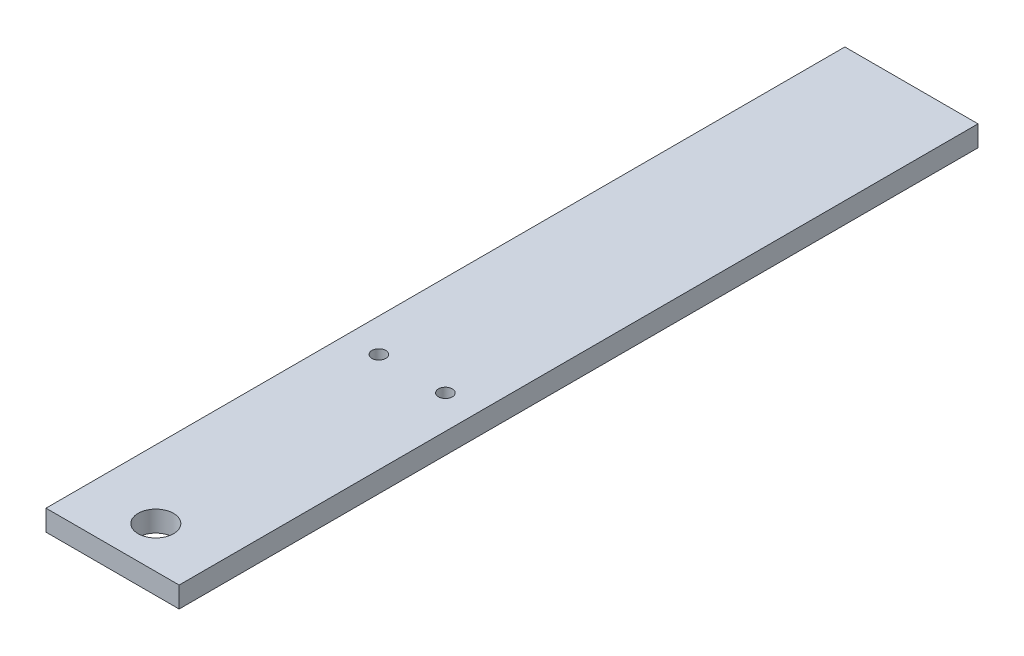
ISO-10303-21;
HEADER;
FILE_DESCRIPTION(('STEP AP214'),'2;1');
FILE_NAME('part.step','',(''),(''),'','','');
FILE_SCHEMA(('AUTOMOTIVE_DESIGN { 1 0 10303 214 1 1 1 1 }'));
ENDSEC;
DATA;
#1=APPLICATION_CONTEXT('core data for automotive mechanical design processes');
#2=APPLICATION_PROTOCOL_DEFINITION('international standard','automotive_design',2000,#1);
#3=PRODUCT_CONTEXT('',#1,'mechanical');
#4=PRODUCT('Part','Part','',(#3));
#5=PRODUCT_RELATED_PRODUCT_CATEGORY('part','',(#4));
#6=PRODUCT_DEFINITION_FORMATION('','',#4);
#7=PRODUCT_DEFINITION_CONTEXT('part definition',#1,'design');
#8=PRODUCT_DEFINITION('design','',#6,#7);
#9=PRODUCT_DEFINITION_SHAPE('','',#8);
#10=(LENGTH_UNIT() NAMED_UNIT(*) SI_UNIT(.MILLI.,.METRE.));
#11=(NAMED_UNIT(*) PLANE_ANGLE_UNIT() SI_UNIT($,.RADIAN.));
#12=(NAMED_UNIT(*) SI_UNIT($,.STERADIAN.) SOLID_ANGLE_UNIT());
#13=UNCERTAINTY_MEASURE_WITH_UNIT(LENGTH_MEASURE(1.E-05),#10,'distance_accuracy_value','');
#14=(GEOMETRIC_REPRESENTATION_CONTEXT(3) GLOBAL_UNCERTAINTY_ASSIGNED_CONTEXT((#13)) GLOBAL_UNIT_ASSIGNED_CONTEXT((#10,
#11,#12)) REPRESENTATION_CONTEXT('',''));
#15=CARTESIAN_POINT('',(0.,0.,0.));
#16=DIRECTION('',(0.,0.,1.));
#17=DIRECTION('',(1.,0.,0.));
#18=AXIS2_PLACEMENT_3D('',#15,#16,#17);
#19=CARTESIAN_POINT('',(25.4,-3.96875,76.2));
#20=DIRECTION('',(0.,1.,0.));
#21=DIRECTION('',(0.,0.,1.));
#22=AXIS2_PLACEMENT_3D('',#19,#20,#21);
#23=PLANE('',#22);
#24=CARTESIAN_POINT('',(-12.7,-3.96875,-38.1));
#25=DIRECTION('',(0.,-1.,0.));
#26=DIRECTION('',(0.,0.,-1.));
#27=AXIS2_PLACEMENT_3D('',#24,#25,#26);
#28=CIRCLE('',#27,5.2);
#29=CARTESIAN_POINT('',(-12.7,-3.96875,-43.3));
#30=VERTEX_POINT('',#29);
#31=EDGE_CURVE('E114',#30,#30,#28,.T.);
#32=ORIENTED_EDGE('',*,*,#31,.F.);
#33=EDGE_LOOP('',(#32));
#34=FACE_BOUND('',#33,.T.);
#35=CARTESIAN_POINT('',(0.625840615318438,-3.96875,60.325));
#36=DIRECTION('',(0.,1.,0.));
#37=DIRECTION('',(0.,0.,1.));
#38=AXIS2_PLACEMENT_3D('',#35,#36,#37);
#39=CIRCLE('',#38,6.75);
#40=CARTESIAN_POINT('',(0.625840615318438,-3.96875,67.075));
#41=VERTEX_POINT('',#40);
#42=EDGE_CURVE('E126',#41,#41,#39,.T.);
#43=ORIENTED_EDGE('',*,*,#42,.T.);
#44=EDGE_LOOP('',(#43));
#45=FACE_BOUND('',#44,.T.);
#46=DIRECTION('',(0.,0.,-1.));
#47=VECTOR('',#46,1.);
#48=CARTESIAN_POINT('',(-25.4,-3.96875,76.2));
#49=LINE('',#48,#47);
#50=CARTESIAN_POINT('',(-25.4,-3.96875,76.2));
#51=VERTEX_POINT('',#50);
#52=CARTESIAN_POINT('',(-25.4,-3.96874999999999,-228.6));
#53=VERTEX_POINT('',#52);
#54=EDGE_CURVE('E11',#51,#53,#49,.T.);
#55=ORIENTED_EDGE('',*,*,#54,.T.);
#56=DIRECTION('',(1.,0.,0.));
#57=VECTOR('',#56,1.);
#58=CARTESIAN_POINT('',(25.4,-3.96874999999999,-228.6));
#59=LINE('',#58,#57);
#60=CARTESIAN_POINT('',(25.4,-3.96874999999999,-228.6));
#61=VERTEX_POINT('',#60);
#62=EDGE_CURVE('E102',#53,#61,#59,.T.);
#63=ORIENTED_EDGE('',*,*,#62,.T.);
#64=DIRECTION('',(0.,0.,-1.));
#65=VECTOR('',#64,1.);
#66=CARTESIAN_POINT('',(25.4,-3.96875,76.2));
#67=LINE('',#66,#65);
#68=CARTESIAN_POINT('',(25.4,-3.96875,76.2));
#69=VERTEX_POINT('',#68);
#70=EDGE_CURVE('E49',#69,#61,#67,.T.);
#71=ORIENTED_EDGE('',*,*,#70,.F.);
#72=DIRECTION('',(1.,0.,0.));
#73=VECTOR('',#72,1.);
#74=CARTESIAN_POINT('',(25.4,-3.96875,76.2));
#75=LINE('',#74,#73);
#76=EDGE_CURVE('E131',#51,#69,#75,.T.);
#77=ORIENTED_EDGE('',*,*,#76,.F.);
#78=EDGE_LOOP('',(#55,#63,#71,#77));
#79=FACE_BOUND('',#78,.T.);
#80=CARTESIAN_POINT('',(12.7,-3.96875,-38.1));
#81=DIRECTION('',(0.,-1.,0.));
#82=DIRECTION('',(0.,0.,-1.));
#83=AXIS2_PLACEMENT_3D('',#80,#81,#82);
#84=CIRCLE('',#83,5.2);
#85=CARTESIAN_POINT('',(12.7,-3.96875,-43.3));
#86=VERTEX_POINT('',#85);
#87=EDGE_CURVE('E105',#86,#86,#84,.T.);
#88=ORIENTED_EDGE('',*,*,#87,.F.);
#89=EDGE_LOOP('',(#88));
#90=FACE_BOUND('',#89,.T.);
#91=ADVANCED_FACE('F41',(#34,#45,#79,#90),#23,.F.);
#92=CARTESIAN_POINT('',(-25.4,3.96875,76.2));
#93=DIRECTION('',(1.,0.,0.));
#94=DIRECTION('',(0.,0.,-1.));
#95=AXIS2_PLACEMENT_3D('',#92,#93,#94);
#96=PLANE('',#95);
#97=DIRECTION('',(0.,0.,-1.));
#98=VECTOR('',#97,1.);
#99=CARTESIAN_POINT('',(-25.4,3.96875,76.2));
#100=LINE('',#99,#98);
#101=CARTESIAN_POINT('',(-25.4,3.96875,76.2));
#102=VERTEX_POINT('',#101);
#103=CARTESIAN_POINT('',(-25.4,3.96875,-228.6));
#104=VERTEX_POINT('',#103);
#105=EDGE_CURVE('E86',#102,#104,#100,.T.);
#106=ORIENTED_EDGE('',*,*,#105,.T.);
#107=DIRECTION('',(0.,1.,0.));
#108=VECTOR('',#107,1.);
#109=CARTESIAN_POINT('',(-25.4,-164.612455136554,-228.6));
#110=LINE('',#109,#108);
#111=EDGE_CURVE('E95',#53,#104,#110,.T.);
#112=ORIENTED_EDGE('',*,*,#111,.F.);
#113=ORIENTED_EDGE('',*,*,#54,.F.);
#114=DIRECTION('',(0.,-1.,0.));
#115=VECTOR('',#114,1.);
#116=CARTESIAN_POINT('',(-25.4,3.96875,76.2));
#117=LINE('',#116,#115);
#118=EDGE_CURVE('E129',#102,#51,#117,.T.);
#119=ORIENTED_EDGE('',*,*,#118,.F.);
#120=EDGE_LOOP('',(#106,#112,#113,#119));
#121=FACE_BOUND('',#120,.T.);
#122=ADVANCED_FACE('F43',(#121),#96,.F.);
#123=CARTESIAN_POINT('',(25.4,3.96875,76.2));
#124=DIRECTION('',(-1.,0.,0.));
#125=DIRECTION('',(0.,0.,1.));
#126=AXIS2_PLACEMENT_3D('',#123,#124,#125);
#127=PLANE('',#126);
#128=ORIENTED_EDGE('',*,*,#70,.T.);
#129=DIRECTION('',(0.,1.,0.));
#130=VECTOR('',#129,1.);
#131=CARTESIAN_POINT('',(25.4,-164.612455136554,-228.6));
#132=LINE('',#131,#130);
#133=CARTESIAN_POINT('',(25.4,3.96875,-228.6));
#134=VERTEX_POINT('',#133);
#135=EDGE_CURVE('E89',#61,#134,#132,.T.);
#136=ORIENTED_EDGE('',*,*,#135,.T.);
#137=DIRECTION('',(0.,0.,-1.));
#138=VECTOR('',#137,1.);
#139=CARTESIAN_POINT('',(25.4,3.96875,76.2));
#140=LINE('',#139,#138);
#141=CARTESIAN_POINT('',(25.4,3.96875,76.2));
#142=VERTEX_POINT('',#141);
#143=EDGE_CURVE('E80',#142,#134,#140,.T.);
#144=ORIENTED_EDGE('',*,*,#143,.F.);
#145=DIRECTION('',(0.,1.,0.));
#146=VECTOR('',#145,1.);
#147=CARTESIAN_POINT('',(25.4,3.96875,76.2));
#148=LINE('',#147,#146);
#149=EDGE_CURVE('E61',#69,#142,#148,.T.);
#150=ORIENTED_EDGE('',*,*,#149,.F.);
#151=EDGE_LOOP('',(#128,#136,#144,#150));
#152=FACE_BOUND('',#151,.T.);
#153=ADVANCED_FACE('F90',(#152),#127,.F.);
#154=CARTESIAN_POINT('',(25.4,3.96875,76.2));
#155=DIRECTION('',(0.,-1.,0.));
#156=DIRECTION('',(0.,0.,-1.));
#157=AXIS2_PLACEMENT_3D('',#154,#155,#156);
#158=PLANE('',#157);
#159=CARTESIAN_POINT('',(12.7,3.96875,-38.1));
#160=DIRECTION('',(0.,-1.,0.));
#161=DIRECTION('',(0.,0.,-1.));
#162=AXIS2_PLACEMENT_3D('',#159,#160,#161);
#163=CIRCLE('',#162,2.65);
#164=CARTESIAN_POINT('',(12.7,3.96875,-40.75));
#165=VERTEX_POINT('',#164);
#166=EDGE_CURVE('E111',#165,#165,#163,.T.);
#167=ORIENTED_EDGE('',*,*,#166,.T.);
#168=EDGE_LOOP('',(#167));
#169=FACE_BOUND('',#168,.T.);
#170=CARTESIAN_POINT('',(-12.7,3.96875,-38.1));
#171=DIRECTION('',(0.,-1.,0.));
#172=DIRECTION('',(0.,0.,-1.));
#173=AXIS2_PLACEMENT_3D('',#170,#171,#172);
#174=CIRCLE('',#173,2.65);
#175=CARTESIAN_POINT('',(-12.7,3.96875,-40.75));
#176=VERTEX_POINT('',#175);
#177=EDGE_CURVE('E120',#176,#176,#174,.T.);
#178=ORIENTED_EDGE('',*,*,#177,.T.);
#179=EDGE_LOOP('',(#178));
#180=FACE_BOUND('',#179,.T.);
#181=CARTESIAN_POINT('',(0.625840615318438,3.96875,60.325));
#182=DIRECTION('',(0.,1.,0.));
#183=DIRECTION('',(0.,0.,1.));
#184=AXIS2_PLACEMENT_3D('',#181,#182,#183);
#185=CIRCLE('',#184,6.75);
#186=CARTESIAN_POINT('',(0.625840615318438,3.96875,67.075));
#187=VERTEX_POINT('',#186);
#188=EDGE_CURVE('E123',#187,#187,#185,.T.);
#189=ORIENTED_EDGE('',*,*,#188,.F.);
#190=EDGE_LOOP('',(#189));
#191=FACE_BOUND('',#190,.T.);
#192=ORIENTED_EDGE('',*,*,#143,.T.);
#193=DIRECTION('',(-1.,0.,0.));
#194=VECTOR('',#193,1.);
#195=CARTESIAN_POINT('',(25.4,3.96875,-228.6));
#196=LINE('',#195,#194);
#197=EDGE_CURVE('E84',#134,#104,#196,.T.);
#198=ORIENTED_EDGE('',*,*,#197,.T.);
#199=ORIENTED_EDGE('',*,*,#105,.F.);
#200=DIRECTION('',(-1.,0.,0.));
#201=VECTOR('',#200,1.);
#202=CARTESIAN_POINT('',(25.4,3.96875,76.2));
#203=LINE('',#202,#201);
#204=EDGE_CURVE('E56',#142,#102,#203,.T.);
#205=ORIENTED_EDGE('',*,*,#204,.F.);
#206=EDGE_LOOP('',(#192,#198,#199,#205));
#207=FACE_BOUND('',#206,.T.);
#208=ADVANCED_FACE('F82',(#169,#180,#191,#207),#158,.F.);
#209=CARTESIAN_POINT('',(0.,0.,76.2));
#210=DIRECTION('',(0.,0.,-1.));
#211=DIRECTION('',(-1.,0.,0.));
#212=AXIS2_PLACEMENT_3D('',#209,#210,#211);
#213=PLANE('',#212);
#214=ORIENTED_EDGE('',*,*,#118,.T.);
#215=ORIENTED_EDGE('',*,*,#76,.T.);
#216=ORIENTED_EDGE('',*,*,#149,.T.);
#217=ORIENTED_EDGE('',*,*,#204,.T.);
#218=EDGE_LOOP('',(#214,#215,#216,#217));
#219=FACE_BOUND('',#218,.T.);
#220=ADVANCED_FACE('F138',(#219),#213,.F.);
#221=CARTESIAN_POINT('',(0.625840615318438,3.96875,60.325));
#222=DIRECTION('',(0.,1.,0.));
#223=DIRECTION('',(0.,0.,1.));
#224=AXIS2_PLACEMENT_3D('',#221,#222,#223);
#225=CYLINDRICAL_SURFACE('',#224,6.75);
#226=ORIENTED_EDGE('',*,*,#42,.F.);
#227=EDGE_LOOP('',(#226));
#228=FACE_BOUND('',#227,.T.);
#229=ORIENTED_EDGE('',*,*,#188,.T.);
#230=EDGE_LOOP('',(#229));
#231=FACE_BOUND('',#230,.T.);
#232=ADVANCED_FACE('F166',(#228,#231),#225,.F.);
#233=CARTESIAN_POINT('',(-12.7,-3.96875,-38.1));
#234=DIRECTION('',(0.,-1.,0.));
#235=DIRECTION('',(0.,0.,-1.));
#236=AXIS2_PLACEMENT_3D('',#233,#234,#235);
#237=CYLINDRICAL_SURFACE('',#236,2.65);
#238=ORIENTED_EDGE('',*,*,#177,.F.);
#239=EDGE_LOOP('',(#238));
#240=FACE_BOUND('',#239,.T.);
#241=CARTESIAN_POINT('',(-12.7,-1.41875,-38.1));
#242=DIRECTION('',(0.,-1.,0.));
#243=DIRECTION('',(0.,0.,-1.));
#244=AXIS2_PLACEMENT_3D('',#241,#242,#243);
#245=CIRCLE('',#244,2.65);
#246=CARTESIAN_POINT('',(-12.7,-1.41875,-40.75));
#247=VERTEX_POINT('',#246);
#248=EDGE_CURVE('E117',#247,#247,#245,.T.);
#249=ORIENTED_EDGE('',*,*,#248,.T.);
#250=EDGE_LOOP('',(#249));
#251=FACE_BOUND('',#250,.T.);
#252=ADVANCED_FACE('F162',(#240,#251),#237,.F.);
#253=CARTESIAN_POINT('',(-12.7,-3.96875,-38.1));
#254=DIRECTION('',(0.,-1.,0.));
#255=DIRECTION('',(0.,0.,-1.));
#256=AXIS2_PLACEMENT_3D('',#253,#254,#255);
#257=CONICAL_SURFACE('',#256,5.2,0.785398163397449);
#258=ORIENTED_EDGE('',*,*,#248,.F.);
#259=EDGE_LOOP('',(#258));
#260=FACE_BOUND('',#259,.T.);
#261=ORIENTED_EDGE('',*,*,#31,.T.);
#262=EDGE_LOOP('',(#261));
#263=FACE_BOUND('',#262,.T.);
#264=ADVANCED_FACE('F155',(#260,#263),#257,.F.);
#265=CARTESIAN_POINT('',(12.7,-3.96875,-38.1));
#266=DIRECTION('',(0.,-1.,0.));
#267=DIRECTION('',(0.,0.,-1.));
#268=AXIS2_PLACEMENT_3D('',#265,#266,#267);
#269=CYLINDRICAL_SURFACE('',#268,2.65);
#270=ORIENTED_EDGE('',*,*,#166,.F.);
#271=EDGE_LOOP('',(#270));
#272=FACE_BOUND('',#271,.T.);
#273=CARTESIAN_POINT('',(12.7,-1.41875,-38.1));
#274=DIRECTION('',(0.,-1.,0.));
#275=DIRECTION('',(0.,0.,-1.));
#276=AXIS2_PLACEMENT_3D('',#273,#274,#275);
#277=CIRCLE('',#276,2.65);
#278=CARTESIAN_POINT('',(12.7,-1.41875,-40.75));
#279=VERTEX_POINT('',#278);
#280=EDGE_CURVE('E108',#279,#279,#277,.T.);
#281=ORIENTED_EDGE('',*,*,#280,.T.);
#282=EDGE_LOOP('',(#281));
#283=FACE_BOUND('',#282,.T.);
#284=ADVANCED_FACE('F147',(#272,#283),#269,.F.);
#285=CARTESIAN_POINT('',(12.7,-3.96875,-38.1));
#286=DIRECTION('',(0.,-1.,0.));
#287=DIRECTION('',(0.,0.,-1.));
#288=AXIS2_PLACEMENT_3D('',#285,#286,#287);
#289=CONICAL_SURFACE('',#288,5.2,0.785398163397448);
#290=ORIENTED_EDGE('',*,*,#280,.F.);
#291=EDGE_LOOP('',(#290));
#292=FACE_BOUND('',#291,.T.);
#293=ORIENTED_EDGE('',*,*,#87,.T.);
#294=EDGE_LOOP('',(#293));
#295=FACE_BOUND('',#294,.T.);
#296=ADVANCED_FACE('F145',(#292,#295),#289,.F.);
#297=CARTESIAN_POINT('',(25.4,-164.612455136554,-228.6));
#298=DIRECTION('',(0.,0.,-1.));
#299=DIRECTION('',(-1.,0.,0.));
#300=AXIS2_PLACEMENT_3D('',#297,#298,#299);
#301=PLANE('',#300);
#302=ORIENTED_EDGE('',*,*,#62,.F.);
#303=ORIENTED_EDGE('',*,*,#111,.T.);
#304=ORIENTED_EDGE('',*,*,#197,.F.);
#305=ORIENTED_EDGE('',*,*,#135,.F.);
#306=EDGE_LOOP('',(#302,#303,#304,#305));
#307=FACE_BOUND('',#306,.T.);
#308=ADVANCED_FACE('F98',(#307),#301,.T.);
#309=CLOSED_SHELL('',(#91,#122,#153,#208,#220,#232,#252,#264,#284,#296,#308));
#310=MANIFOLD_SOLID_BREP('B2',#309);
#311=ADVANCED_BREP_SHAPE_REPRESENTATION('',(#18,#310),#14);
#312=SHAPE_DEFINITION_REPRESENTATION(#9,#311);
ENDSEC;
END-ISO-10303-21;
